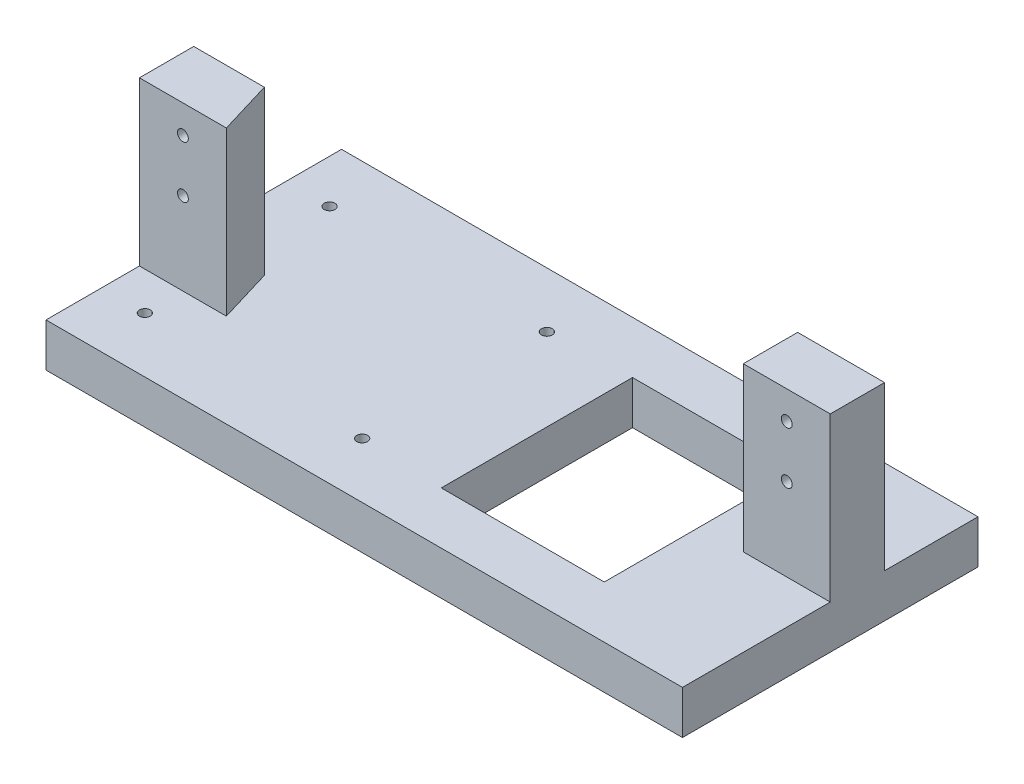
ISO-10303-21;
HEADER;
FILE_DESCRIPTION(('STEP AP214'),'2;1');
FILE_NAME('part.step','',(''),(''),'','','');
FILE_SCHEMA(('AUTOMOTIVE_DESIGN { 1 0 10303 214 1 1 1 1 }'));
ENDSEC;
DATA;
#1=APPLICATION_CONTEXT('core data for automotive mechanical design processes');
#2=APPLICATION_PROTOCOL_DEFINITION('international standard','automotive_design',2000,#1);
#3=PRODUCT_CONTEXT('',#1,'mechanical');
#4=PRODUCT('Part','Part','',(#3));
#5=PRODUCT_RELATED_PRODUCT_CATEGORY('part','',(#4));
#6=PRODUCT_DEFINITION_FORMATION('','',#4);
#7=PRODUCT_DEFINITION_CONTEXT('part definition',#1,'design');
#8=PRODUCT_DEFINITION('design','',#6,#7);
#9=PRODUCT_DEFINITION_SHAPE('','',#8);
#10=(LENGTH_UNIT() NAMED_UNIT(*) SI_UNIT(.MILLI.,.METRE.));
#11=(NAMED_UNIT(*) PLANE_ANGLE_UNIT() SI_UNIT($,.RADIAN.));
#12=(NAMED_UNIT(*) SI_UNIT($,.STERADIAN.) SOLID_ANGLE_UNIT());
#13=UNCERTAINTY_MEASURE_WITH_UNIT(LENGTH_MEASURE(1.E-05),#10,'distance_accuracy_value','');
#14=(GEOMETRIC_REPRESENTATION_CONTEXT(3) GLOBAL_UNCERTAINTY_ASSIGNED_CONTEXT((#13)) GLOBAL_UNIT_ASSIGNED_CONTEXT((#10,
#11,#12)) REPRESENTATION_CONTEXT('',''));
#15=CARTESIAN_POINT('',(0.,0.,0.));
#16=DIRECTION('',(0.,0.,1.));
#17=DIRECTION('',(1.,0.,0.));
#18=AXIS2_PLACEMENT_3D('',#15,#16,#17);
#19=CARTESIAN_POINT('',(0.,5.08,0.));
#20=DIRECTION('',(0.,-1.,0.));
#21=DIRECTION('',(0.,0.,-1.));
#22=AXIS2_PLACEMENT_3D('',#19,#20,#21);
#23=PLANE('',#22);
#24=CARTESIAN_POINT('',(5.08,5.08,-6.477));
#25=DIRECTION('',(0.,-1.,0.));
#26=DIRECTION('',(0.,0.,-1.));
#27=AXIS2_PLACEMENT_3D('',#24,#25,#26);
#28=CIRCLE('',#27,0.635000000000001);
#29=CARTESIAN_POINT('',(5.08,5.08,-7.112));
#30=VERTEX_POINT('',#29);
#31=EDGE_CURVE('E316',#30,#30,#28,.T.);
#32=ORIENTED_EDGE('',*,*,#31,.T.);
#33=EDGE_LOOP('',(#32));
#34=FACE_BOUND('',#33,.T.);
#35=CARTESIAN_POINT('',(30.48,5.08,-6.47699999999999));
#36=DIRECTION('',(0.,-1.,0.));
#37=DIRECTION('',(0.,0.,-1.));
#38=AXIS2_PLACEMENT_3D('',#35,#36,#37);
#39=CIRCLE('',#38,0.634999999999999);
#40=CARTESIAN_POINT('',(30.48,5.08,-7.11199999999999));
#41=VERTEX_POINT('',#40);
#42=EDGE_CURVE('E310',#41,#41,#39,.T.);
#43=ORIENTED_EDGE('',*,*,#42,.T.);
#44=EDGE_LOOP('',(#43));
#45=FACE_BOUND('',#44,.T.);
#46=CARTESIAN_POINT('',(30.48,5.08,-28.067));
#47=DIRECTION('',(0.,-1.,0.));
#48=DIRECTION('',(0.,0.,-1.));
#49=AXIS2_PLACEMENT_3D('',#46,#47,#48);
#50=CIRCLE('',#49,0.634999999999999);
#51=CARTESIAN_POINT('',(30.48,5.08,-28.702));
#52=VERTEX_POINT('',#51);
#53=EDGE_CURVE('E304',#52,#52,#50,.T.);
#54=ORIENTED_EDGE('',*,*,#53,.T.);
#55=EDGE_LOOP('',(#54));
#56=FACE_BOUND('',#55,.T.);
#57=CARTESIAN_POINT('',(5.08,5.08,-28.067));
#58=DIRECTION('',(0.,-1.,0.));
#59=DIRECTION('',(0.,0.,-1.));
#60=AXIS2_PLACEMENT_3D('',#57,#58,#59);
#61=CIRCLE('',#60,0.635);
#62=CARTESIAN_POINT('',(5.08,5.08,-28.702));
#63=VERTEX_POINT('',#62);
#64=EDGE_CURVE('E288',#63,#63,#61,.T.);
#65=ORIENTED_EDGE('',*,*,#64,.T.);
#66=EDGE_LOOP('',(#65));
#67=FACE_BOUND('',#66,.T.);
#68=DIRECTION('',(1.,0.,0.));
#69=VECTOR('',#68,1.);
#70=CARTESIAN_POINT('',(40.10914,5.08,-6.096));
#71=LINE('',#70,#69);
#72=CARTESIAN_POINT('',(40.10914,5.08,-6.096));
#73=VERTEX_POINT('',#72);
#74=CARTESIAN_POINT('',(59.15914,5.08,-6.096));
#75=VERTEX_POINT('',#74);
#76=EDGE_CURVE('E284',#73,#75,#71,.T.);
#77=ORIENTED_EDGE('',*,*,#76,.F.);
#78=DIRECTION('',(0.,0.,1.));
#79=VECTOR('',#78,1.);
#80=CARTESIAN_POINT('',(40.10914,5.08,-28.448));
#81=LINE('',#80,#79);
#82=CARTESIAN_POINT('',(40.10914,5.08,-28.448));
#83=VERTEX_POINT('',#82);
#84=EDGE_CURVE('E60',#83,#73,#81,.T.);
#85=ORIENTED_EDGE('',*,*,#84,.F.);
#86=DIRECTION('',(-1.,0.,0.));
#87=VECTOR('',#86,1.);
#88=CARTESIAN_POINT('',(40.10914,5.08,-28.448));
#89=LINE('',#88,#87);
#90=CARTESIAN_POINT('',(59.15914,5.08,-28.448));
#91=VERTEX_POINT('',#90);
#92=EDGE_CURVE('E277',#91,#83,#89,.T.);
#93=ORIENTED_EDGE('',*,*,#92,.F.);
#94=DIRECTION('',(0.,0.,-1.));
#95=VECTOR('',#94,1.);
#96=CARTESIAN_POINT('',(59.15914,5.08,-28.448));
#97=LINE('',#96,#95);
#98=EDGE_CURVE('E281',#75,#91,#97,.T.);
#99=ORIENTED_EDGE('',*,*,#98,.F.);
#100=EDGE_LOOP('',(#77,#85,#93,#99));
#101=FACE_BOUND('',#100,.T.);
#102=DIRECTION('',(-1.,0.,0.));
#103=VECTOR('',#102,1.);
#104=CARTESIAN_POINT('',(74.39914,5.08,-23.622));
#105=LINE('',#104,#103);
#106=CARTESIAN_POINT('',(74.39914,5.08,-23.622));
#107=VERTEX_POINT('',#106);
#108=CARTESIAN_POINT('',(64.23914,5.08,-23.622));
#109=VERTEX_POINT('',#108);
#110=EDGE_CURVE('E254',#107,#109,#105,.T.);
#111=ORIENTED_EDGE('',*,*,#110,.F.);
#112=DIRECTION('',(0.,0.,-1.));
#113=VECTOR('',#112,1.);
#114=CARTESIAN_POINT('',(74.39914,5.08,0.));
#115=LINE('',#114,#113);
#116=CARTESIAN_POINT('',(74.39914,5.08,-34.544));
#117=VERTEX_POINT('',#116);
#118=EDGE_CURVE('E222',#107,#117,#115,.T.);
#119=ORIENTED_EDGE('',*,*,#118,.T.);
#120=DIRECTION('',(-1.,0.,0.));
#121=VECTOR('',#120,1.);
#122=CARTESIAN_POINT('',(0.,5.08,-34.544));
#123=LINE('',#122,#121);
#124=CARTESIAN_POINT('',(0.,5.08,-34.544));
#125=VERTEX_POINT('',#124);
#126=EDGE_CURVE('E210',#117,#125,#123,.T.);
#127=ORIENTED_EDGE('',*,*,#126,.T.);
#128=DIRECTION('',(0.,0.,1.));
#129=VECTOR('',#128,1.);
#130=CARTESIAN_POINT('',(0.,5.08,0.));
#131=LINE('',#130,#129);
#132=CARTESIAN_POINT('',(0.,5.08,-17.272));
#133=VERTEX_POINT('',#132);
#134=EDGE_CURVE('E167',#125,#133,#131,.T.);
#135=ORIENTED_EDGE('',*,*,#134,.T.);
#136=DIRECTION('',(-1.,0.,0.));
#137=VECTOR('',#136,1.);
#138=CARTESIAN_POINT('',(0.,5.08,-17.272));
#139=LINE('',#138,#137);
#140=CARTESIAN_POINT('',(8.255,5.08,-17.272));
#141=VERTEX_POINT('',#140);
#142=EDGE_CURVE('E38',#141,#133,#139,.T.);
#143=ORIENTED_EDGE('',*,*,#142,.F.);
#144=DIRECTION('',(0.287347885566345,0.,0.957826285221151));
#145=VECTOR('',#144,1.);
#146=CARTESIAN_POINT('',(10.16,5.08,-10.922));
#147=LINE('',#146,#145);
#148=CARTESIAN_POINT('',(10.16,5.08,-10.922));
#149=VERTEX_POINT('',#148);
#150=EDGE_CURVE('E148',#141,#149,#147,.T.);
#151=ORIENTED_EDGE('',*,*,#150,.T.);
#152=DIRECTION('',(1.,0.,0.));
#153=VECTOR('',#152,1.);
#154=CARTESIAN_POINT('',(0.,5.08,-10.922));
#155=LINE('',#154,#153);
#156=CARTESIAN_POINT('',(0.,5.08,-10.922));
#157=VERTEX_POINT('',#156);
#158=EDGE_CURVE('E169',#157,#149,#155,.T.);
#159=ORIENTED_EDGE('',*,*,#158,.F.);
#160=CARTESIAN_POINT('',(0.,5.08,0.));
#161=VERTEX_POINT('',#160);
#162=EDGE_CURVE('E198',#157,#161,#131,.T.);
#163=ORIENTED_EDGE('',*,*,#162,.T.);
#164=DIRECTION('',(1.,0.,0.));
#165=VECTOR('',#164,1.);
#166=CARTESIAN_POINT('',(0.,5.08,0.));
#167=LINE('',#166,#165);
#168=CARTESIAN_POINT('',(74.39914,5.08,0.));
#169=VERTEX_POINT('',#168);
#170=EDGE_CURVE('E194',#161,#169,#167,.T.);
#171=ORIENTED_EDGE('',*,*,#170,.T.);
#172=CARTESIAN_POINT('',(74.39914,5.08,-17.272));
#173=VERTEX_POINT('',#172);
#174=EDGE_CURVE('E221',#169,#173,#115,.T.);
#175=ORIENTED_EDGE('',*,*,#174,.T.);
#176=DIRECTION('',(1.,0.,0.));
#177=VECTOR('',#176,1.);
#178=CARTESIAN_POINT('',(74.39914,5.08,-17.272));
#179=LINE('',#178,#177);
#180=CARTESIAN_POINT('',(64.23914,5.08,-17.272));
#181=VERTEX_POINT('',#180);
#182=EDGE_CURVE('E249',#181,#173,#179,.T.);
#183=ORIENTED_EDGE('',*,*,#182,.F.);
#184=DIRECTION('',(0.,0.,1.));
#185=VECTOR('',#184,1.);
#186=CARTESIAN_POINT('',(64.23914,5.08,-23.622));
#187=LINE('',#186,#185);
#188=EDGE_CURVE('E251',#109,#181,#187,.T.);
#189=ORIENTED_EDGE('',*,*,#188,.F.);
#190=EDGE_LOOP('',(#111,#119,#127,#135,#143,#151,#159,#163,#171,#175,#183,#189));
#191=FACE_BOUND('',#190,.T.);
#192=ADVANCED_FACE('F34',(#34,#45,#56,#67,#101,#191),#23,.F.);
#193=CARTESIAN_POINT('',(0.,5.08,0.));
#194=DIRECTION('',(1.,0.,0.));
#195=DIRECTION('',(0.,0.,-1.));
#196=AXIS2_PLACEMENT_3D('',#193,#194,#195);
#197=PLANE('',#196);
#198=DIRECTION('',(0.,0.,1.));
#199=VECTOR('',#198,1.);
#200=CARTESIAN_POINT('',(0.,0.,0.));
#201=LINE('',#200,#199);
#202=CARTESIAN_POINT('',(0.,0.,-34.544));
#203=VERTEX_POINT('',#202);
#204=CARTESIAN_POINT('',(0.,0.,0.));
#205=VERTEX_POINT('',#204);
#206=EDGE_CURVE('E217',#203,#205,#201,.T.);
#207=ORIENTED_EDGE('',*,*,#206,.T.);
#208=DIRECTION('',(0.,-1.,0.));
#209=VECTOR('',#208,1.);
#210=CARTESIAN_POINT('',(0.,5.08,0.));
#211=LINE('',#210,#209);
#212=EDGE_CURVE('E11',#161,#205,#211,.T.);
#213=ORIENTED_EDGE('',*,*,#212,.F.);
#214=ORIENTED_EDGE('',*,*,#162,.F.);
#215=DIRECTION('',(0.,-1.,0.));
#216=VECTOR('',#215,1.);
#217=CARTESIAN_POINT('',(0.,24.13,-10.922));
#218=LINE('',#217,#216);
#219=CARTESIAN_POINT('',(0.,24.13,-10.922));
#220=VERTEX_POINT('',#219);
#221=EDGE_CURVE('E191',#220,#157,#218,.T.);
#222=ORIENTED_EDGE('',*,*,#221,.F.);
#223=DIRECTION('',(0.,0.,1.));
#224=VECTOR('',#223,1.);
#225=CARTESIAN_POINT('',(0.,24.13,-17.272));
#226=LINE('',#225,#224);
#227=CARTESIAN_POINT('',(0.,24.13,-17.272));
#228=VERTEX_POINT('',#227);
#229=EDGE_CURVE('E184',#228,#220,#226,.T.);
#230=ORIENTED_EDGE('',*,*,#229,.F.);
#231=DIRECTION('',(0.,-1.,0.));
#232=VECTOR('',#231,1.);
#233=CARTESIAN_POINT('',(0.,24.13,-17.272));
#234=LINE('',#233,#232);
#235=EDGE_CURVE('E220',#228,#133,#234,.T.);
#236=ORIENTED_EDGE('',*,*,#235,.T.);
#237=ORIENTED_EDGE('',*,*,#134,.F.);
#238=DIRECTION('',(0.,-1.,0.));
#239=VECTOR('',#238,1.);
#240=CARTESIAN_POINT('',(0.,5.08,-34.544));
#241=LINE('',#240,#239);
#242=EDGE_CURVE('E207',#125,#203,#241,.T.);
#243=ORIENTED_EDGE('',*,*,#242,.T.);
#244=EDGE_LOOP('',(#207,#213,#214,#222,#230,#236,#237,#243));
#245=FACE_BOUND('',#244,.T.);
#246=ADVANCED_FACE('F36',(#245),#197,.F.);
#247=CARTESIAN_POINT('',(0.,5.08,0.));
#248=DIRECTION('',(0.,0.,-1.));
#249=DIRECTION('',(-1.,0.,0.));
#250=AXIS2_PLACEMENT_3D('',#247,#248,#249);
#251=PLANE('',#250);
#252=DIRECTION('',(1.,0.,0.));
#253=VECTOR('',#252,1.);
#254=CARTESIAN_POINT('',(0.,0.,0.));
#255=LINE('',#254,#253);
#256=CARTESIAN_POINT('',(74.39914,0.,0.));
#257=VERTEX_POINT('',#256);
#258=EDGE_CURVE('E215',#205,#257,#255,.T.);
#259=ORIENTED_EDGE('',*,*,#258,.T.);
#260=DIRECTION('',(0.,-1.,0.));
#261=VECTOR('',#260,1.);
#262=CARTESIAN_POINT('',(74.39914,5.08,0.));
#263=LINE('',#262,#261);
#264=EDGE_CURVE('E44',#169,#257,#263,.T.);
#265=ORIENTED_EDGE('',*,*,#264,.F.);
#266=ORIENTED_EDGE('',*,*,#170,.F.);
#267=ORIENTED_EDGE('',*,*,#212,.T.);
#268=EDGE_LOOP('',(#259,#265,#266,#267));
#269=FACE_BOUND('',#268,.T.);
#270=ADVANCED_FACE('F231',(#269),#251,.F.);
#271=CARTESIAN_POINT('',(74.39914,5.08,0.));
#272=DIRECTION('',(-1.,0.,0.));
#273=DIRECTION('',(0.,0.,1.));
#274=AXIS2_PLACEMENT_3D('',#271,#272,#273);
#275=PLANE('',#274);
#276=DIRECTION('',(0.,0.,-1.));
#277=VECTOR('',#276,1.);
#278=CARTESIAN_POINT('',(74.39914,0.,0.));
#279=LINE('',#278,#277);
#280=CARTESIAN_POINT('',(74.39914,0.,-34.544));
#281=VERTEX_POINT('',#280);
#282=EDGE_CURVE('E213',#257,#281,#279,.T.);
#283=ORIENTED_EDGE('',*,*,#282,.T.);
#284=DIRECTION('',(0.,-1.,0.));
#285=VECTOR('',#284,1.);
#286=CARTESIAN_POINT('',(74.39914,5.08,-34.544));
#287=LINE('',#286,#285);
#288=EDGE_CURVE('E204',#117,#281,#287,.T.);
#289=ORIENTED_EDGE('',*,*,#288,.F.);
#290=ORIENTED_EDGE('',*,*,#118,.F.);
#291=DIRECTION('',(0.,-1.,0.));
#292=VECTOR('',#291,1.);
#293=CARTESIAN_POINT('',(74.39914,24.13,-23.622));
#294=LINE('',#293,#292);
#295=CARTESIAN_POINT('',(74.39914,24.13,-23.622));
#296=VERTEX_POINT('',#295);
#297=EDGE_CURVE('E170',#296,#107,#294,.T.);
#298=ORIENTED_EDGE('',*,*,#297,.F.);
#299=DIRECTION('',(0.,0.,-1.));
#300=VECTOR('',#299,1.);
#301=CARTESIAN_POINT('',(74.39914,24.13,-23.622));
#302=LINE('',#301,#300);
#303=CARTESIAN_POINT('',(74.39914,24.13,-17.272));
#304=VERTEX_POINT('',#303);
#305=EDGE_CURVE('E240',#304,#296,#302,.T.);
#306=ORIENTED_EDGE('',*,*,#305,.F.);
#307=DIRECTION('',(0.,-1.,0.));
#308=VECTOR('',#307,1.);
#309=CARTESIAN_POINT('',(74.39914,24.13,-17.272));
#310=LINE('',#309,#308);
#311=EDGE_CURVE('E238',#304,#173,#310,.T.);
#312=ORIENTED_EDGE('',*,*,#311,.T.);
#313=ORIENTED_EDGE('',*,*,#174,.F.);
#314=ORIENTED_EDGE('',*,*,#264,.T.);
#315=EDGE_LOOP('',(#283,#289,#290,#298,#306,#312,#313,#314));
#316=FACE_BOUND('',#315,.T.);
#317=ADVANCED_FACE('F235',(#316),#275,.F.);
#318=CARTESIAN_POINT('',(0.,5.08,-34.544));
#319=DIRECTION('',(0.,0.,1.));
#320=DIRECTION('',(1.,0.,0.));
#321=AXIS2_PLACEMENT_3D('',#318,#319,#320);
#322=PLANE('',#321);
#323=DIRECTION('',(-1.,0.,0.));
#324=VECTOR('',#323,1.);
#325=CARTESIAN_POINT('',(0.,0.,-34.544));
#326=LINE('',#325,#324);
#327=EDGE_CURVE('E211',#281,#203,#326,.T.);
#328=ORIENTED_EDGE('',*,*,#327,.T.);
#329=ORIENTED_EDGE('',*,*,#242,.F.);
#330=ORIENTED_EDGE('',*,*,#126,.F.);
#331=ORIENTED_EDGE('',*,*,#288,.T.);
#332=EDGE_LOOP('',(#328,#329,#330,#331));
#333=FACE_BOUND('',#332,.T.);
#334=ADVANCED_FACE('F345',(#333),#322,.F.);
#335=CARTESIAN_POINT('',(0.,0.,0.));
#336=DIRECTION('',(0.,-1.,0.));
#337=DIRECTION('',(0.,0.,-1.));
#338=AXIS2_PLACEMENT_3D('',#335,#336,#337);
#339=PLANE('',#338);
#340=CARTESIAN_POINT('',(5.08,0.,-6.477));
#341=DIRECTION('',(0.,-1.,0.));
#342=DIRECTION('',(0.,0.,-1.));
#343=AXIS2_PLACEMENT_3D('',#340,#341,#342);
#344=CIRCLE('',#343,0.635000000000001);
#345=CARTESIAN_POINT('',(5.08,0.,-7.112));
#346=VERTEX_POINT('',#345);
#347=EDGE_CURVE('E319',#346,#346,#344,.T.);
#348=ORIENTED_EDGE('',*,*,#347,.F.);
#349=EDGE_LOOP('',(#348));
#350=FACE_BOUND('',#349,.T.);
#351=CARTESIAN_POINT('',(30.48,0.,-6.47699999999999));
#352=DIRECTION('',(0.,-1.,0.));
#353=DIRECTION('',(0.,0.,-1.));
#354=AXIS2_PLACEMENT_3D('',#351,#352,#353);
#355=CIRCLE('',#354,0.634999999999999);
#356=CARTESIAN_POINT('',(30.48,0.,-7.11199999999999));
#357=VERTEX_POINT('',#356);
#358=EDGE_CURVE('E313',#357,#357,#355,.T.);
#359=ORIENTED_EDGE('',*,*,#358,.F.);
#360=EDGE_LOOP('',(#359));
#361=FACE_BOUND('',#360,.T.);
#362=CARTESIAN_POINT('',(30.48,0.,-28.067));
#363=DIRECTION('',(0.,-1.,0.));
#364=DIRECTION('',(0.,0.,-1.));
#365=AXIS2_PLACEMENT_3D('',#362,#363,#364);
#366=CIRCLE('',#365,0.634999999999999);
#367=CARTESIAN_POINT('',(30.48,0.,-28.702));
#368=VERTEX_POINT('',#367);
#369=EDGE_CURVE('E307',#368,#368,#366,.T.);
#370=ORIENTED_EDGE('',*,*,#369,.F.);
#371=EDGE_LOOP('',(#370));
#372=FACE_BOUND('',#371,.T.);
#373=CARTESIAN_POINT('',(5.08,0.,-28.067));
#374=DIRECTION('',(0.,-1.,0.));
#375=DIRECTION('',(0.,0.,-1.));
#376=AXIS2_PLACEMENT_3D('',#373,#374,#375);
#377=CIRCLE('',#376,0.635);
#378=CARTESIAN_POINT('',(5.08,0.,-28.702));
#379=VERTEX_POINT('',#378);
#380=EDGE_CURVE('E301',#379,#379,#377,.T.);
#381=ORIENTED_EDGE('',*,*,#380,.F.);
#382=EDGE_LOOP('',(#381));
#383=FACE_BOUND('',#382,.T.);
#384=DIRECTION('',(0.,0.,1.));
#385=VECTOR('',#384,1.);
#386=CARTESIAN_POINT('',(40.10914,0.,-28.448));
#387=LINE('',#386,#385);
#388=CARTESIAN_POINT('',(40.10914,0.,-28.448));
#389=VERTEX_POINT('',#388);
#390=CARTESIAN_POINT('',(40.10914,0.,-6.096));
#391=VERTEX_POINT('',#390);
#392=EDGE_CURVE('E280',#389,#391,#387,.T.);
#393=ORIENTED_EDGE('',*,*,#392,.T.);
#394=DIRECTION('',(1.,0.,0.));
#395=VECTOR('',#394,1.);
#396=CARTESIAN_POINT('',(40.10914,0.,-6.096));
#397=LINE('',#396,#395);
#398=CARTESIAN_POINT('',(59.15914,0.,-6.096));
#399=VERTEX_POINT('',#398);
#400=EDGE_CURVE('E294',#391,#399,#397,.T.);
#401=ORIENTED_EDGE('',*,*,#400,.T.);
#402=DIRECTION('',(0.,0.,-1.));
#403=VECTOR('',#402,1.);
#404=CARTESIAN_POINT('',(59.15914,0.,-28.448));
#405=LINE('',#404,#403);
#406=CARTESIAN_POINT('',(59.15914,0.,-28.448));
#407=VERTEX_POINT('',#406);
#408=EDGE_CURVE('E291',#399,#407,#405,.T.);
#409=ORIENTED_EDGE('',*,*,#408,.T.);
#410=DIRECTION('',(-1.,0.,0.));
#411=VECTOR('',#410,1.);
#412=CARTESIAN_POINT('',(40.10914,0.,-28.448));
#413=LINE('',#412,#411);
#414=EDGE_CURVE('E272',#407,#389,#413,.T.);
#415=ORIENTED_EDGE('',*,*,#414,.T.);
#416=EDGE_LOOP('',(#393,#401,#409,#415));
#417=FACE_BOUND('',#416,.T.);
#418=ORIENTED_EDGE('',*,*,#206,.F.);
#419=ORIENTED_EDGE('',*,*,#327,.F.);
#420=ORIENTED_EDGE('',*,*,#282,.F.);
#421=ORIENTED_EDGE('',*,*,#258,.F.);
#422=EDGE_LOOP('',(#418,#419,#420,#421));
#423=FACE_BOUND('',#422,.T.);
#424=ADVANCED_FACE('F342',(#350,#361,#372,#383,#417,#423),#339,.T.);
#425=CARTESIAN_POINT('',(0.,24.13,-17.272));
#426=DIRECTION('',(0.,0.,1.));
#427=DIRECTION('',(1.,0.,0.));
#428=AXIS2_PLACEMENT_3D('',#425,#426,#427);
#429=PLANE('',#428);
#430=CARTESIAN_POINT('',(5.08,14.732,-17.272));
#431=DIRECTION('',(0.,0.,-1.));
#432=DIRECTION('',(-1.,0.,0.));
#433=AXIS2_PLACEMENT_3D('',#430,#431,#432);
#434=CIRCLE('',#433,0.635000000000002);
#435=CARTESIAN_POINT('',(4.445,14.732,-17.272));
#436=VERTEX_POINT('',#435);
#437=EDGE_CURVE('E155',#436,#436,#434,.T.);
#438=ORIENTED_EDGE('',*,*,#437,.F.);
#439=EDGE_LOOP('',(#438));
#440=FACE_BOUND('',#439,.T.);
#441=CARTESIAN_POINT('',(5.08,20.828,-17.272));
#442=DIRECTION('',(0.,0.,-1.));
#443=DIRECTION('',(-1.,0.,0.));
#444=AXIS2_PLACEMENT_3D('',#441,#442,#443);
#445=CIRCLE('',#444,0.635000000000002);
#446=CARTESIAN_POINT('',(4.445,20.828,-17.272));
#447=VERTEX_POINT('',#446);
#448=EDGE_CURVE('E323',#447,#447,#445,.T.);
#449=ORIENTED_EDGE('',*,*,#448,.F.);
#450=EDGE_LOOP('',(#449));
#451=FACE_BOUND('',#450,.T.);
#452=DIRECTION('',(-1.,0.,0.));
#453=VECTOR('',#452,1.);
#454=CARTESIAN_POINT('',(0.,24.13,-17.272));
#455=LINE('',#454,#453);
#456=CARTESIAN_POINT('',(8.255,24.13,-17.272));
#457=VERTEX_POINT('',#456);
#458=EDGE_CURVE('E162',#457,#228,#455,.T.);
#459=ORIENTED_EDGE('',*,*,#458,.F.);
#460=DIRECTION('',(0.,1.,0.));
#461=VECTOR('',#460,1.);
#462=CARTESIAN_POINT('',(8.255,-1.5495946331582,-17.272));
#463=LINE('',#462,#461);
#464=EDGE_CURVE('E52',#141,#457,#463,.T.);
#465=ORIENTED_EDGE('',*,*,#464,.F.);
#466=ORIENTED_EDGE('',*,*,#142,.T.);
#467=ORIENTED_EDGE('',*,*,#235,.F.);
#468=EDGE_LOOP('',(#459,#465,#466,#467));
#469=FACE_BOUND('',#468,.T.);
#470=ADVANCED_FACE('F159',(#440,#451,#469),#429,.F.);
#471=CARTESIAN_POINT('',(0.,24.13,-10.922));
#472=DIRECTION('',(0.,0.,-1.));
#473=DIRECTION('',(-1.,0.,0.));
#474=AXIS2_PLACEMENT_3D('',#471,#472,#473);
#475=PLANE('',#474);
#476=CARTESIAN_POINT('',(5.08,14.732,-10.922));
#477=DIRECTION('',(0.,0.,-1.));
#478=DIRECTION('',(-1.,0.,0.));
#479=AXIS2_PLACEMENT_3D('',#476,#477,#478);
#480=CIRCLE('',#479,0.635000000000002);
#481=CARTESIAN_POINT('',(4.445,14.732,-10.922));
#482=VERTEX_POINT('',#481);
#483=EDGE_CURVE('E326',#482,#482,#480,.T.);
#484=ORIENTED_EDGE('',*,*,#483,.T.);
#485=EDGE_LOOP('',(#484));
#486=FACE_BOUND('',#485,.T.);
#487=CARTESIAN_POINT('',(5.08,20.828,-10.922));
#488=DIRECTION('',(0.,0.,-1.));
#489=DIRECTION('',(-1.,0.,0.));
#490=AXIS2_PLACEMENT_3D('',#487,#488,#489);
#491=CIRCLE('',#490,0.635000000000002);
#492=CARTESIAN_POINT('',(4.445,20.828,-10.922));
#493=VERTEX_POINT('',#492);
#494=EDGE_CURVE('E322',#493,#493,#491,.T.);
#495=ORIENTED_EDGE('',*,*,#494,.T.);
#496=EDGE_LOOP('',(#495));
#497=FACE_BOUND('',#496,.T.);
#498=ORIENTED_EDGE('',*,*,#158,.T.);
#499=DIRECTION('',(0.,-1.,0.));
#500=VECTOR('',#499,1.);
#501=CARTESIAN_POINT('',(10.16,24.13,-10.922));
#502=LINE('',#501,#500);
#503=CARTESIAN_POINT('',(10.16,24.13,-10.922));
#504=VERTEX_POINT('',#503);
#505=EDGE_CURVE('E151',#504,#149,#502,.T.);
#506=ORIENTED_EDGE('',*,*,#505,.F.);
#507=DIRECTION('',(1.,0.,0.));
#508=VECTOR('',#507,1.);
#509=CARTESIAN_POINT('',(0.,24.13,-10.922));
#510=LINE('',#509,#508);
#511=EDGE_CURVE('E186',#220,#504,#510,.T.);
#512=ORIENTED_EDGE('',*,*,#511,.F.);
#513=ORIENTED_EDGE('',*,*,#221,.T.);
#514=EDGE_LOOP('',(#498,#506,#512,#513));
#515=FACE_BOUND('',#514,.T.);
#516=ADVANCED_FACE('F336',(#486,#497,#515),#475,.F.);
#517=CARTESIAN_POINT('',(0.,24.13,0.));
#518=DIRECTION('',(0.,1.,0.));
#519=DIRECTION('',(0.,0.,1.));
#520=AXIS2_PLACEMENT_3D('',#517,#518,#519);
#521=PLANE('',#520);
#522=DIRECTION('',(0.287347885566345,0.,0.957826285221151));
#523=VECTOR('',#522,1.);
#524=CARTESIAN_POINT('',(10.16,24.13,-10.922));
#525=LINE('',#524,#523);
#526=EDGE_CURVE('E163',#457,#504,#525,.T.);
#527=ORIENTED_EDGE('',*,*,#526,.F.);
#528=ORIENTED_EDGE('',*,*,#458,.T.);
#529=ORIENTED_EDGE('',*,*,#229,.T.);
#530=ORIENTED_EDGE('',*,*,#511,.T.);
#531=EDGE_LOOP('',(#527,#528,#529,#530));
#532=FACE_BOUND('',#531,.T.);
#533=ADVANCED_FACE('F331',(#532),#521,.T.);
#534=CARTESIAN_POINT('',(74.39914,24.13,-23.622));
#535=DIRECTION('',(0.,0.,1.));
#536=DIRECTION('',(1.,0.,0.));
#537=AXIS2_PLACEMENT_3D('',#534,#535,#536);
#538=PLANE('',#537);
#539=CARTESIAN_POINT('',(69.31914,14.732,-23.622));
#540=DIRECTION('',(0.,0.,-1.));
#541=DIRECTION('',(-1.,0.,0.));
#542=AXIS2_PLACEMENT_3D('',#539,#540,#541);
#543=CIRCLE('',#542,0.635000000000002);
#544=CARTESIAN_POINT('',(68.68414,14.732,-23.622));
#545=VERTEX_POINT('',#544);
#546=EDGE_CURVE('E265',#545,#545,#543,.T.);
#547=ORIENTED_EDGE('',*,*,#546,.F.);
#548=EDGE_LOOP('',(#547));
#549=FACE_BOUND('',#548,.T.);
#550=CARTESIAN_POINT('',(69.31914,20.828,-23.622));
#551=DIRECTION('',(0.,0.,-1.));
#552=DIRECTION('',(-1.,0.,0.));
#553=AXIS2_PLACEMENT_3D('',#550,#551,#552);
#554=CIRCLE('',#553,0.635000000000002);
#555=CARTESIAN_POINT('',(68.68414,20.828,-23.622));
#556=VERTEX_POINT('',#555);
#557=EDGE_CURVE('E261',#556,#556,#554,.T.);
#558=ORIENTED_EDGE('',*,*,#557,.F.);
#559=EDGE_LOOP('',(#558));
#560=FACE_BOUND('',#559,.T.);
#561=ORIENTED_EDGE('',*,*,#110,.T.);
#562=DIRECTION('',(0.,-1.,0.));
#563=VECTOR('',#562,1.);
#564=CARTESIAN_POINT('',(64.23914,24.13,-23.622));
#565=LINE('',#564,#563);
#566=CARTESIAN_POINT('',(64.23914,24.13,-23.622));
#567=VERTEX_POINT('',#566);
#568=EDGE_CURVE('E173',#567,#109,#565,.T.);
#569=ORIENTED_EDGE('',*,*,#568,.F.);
#570=DIRECTION('',(-1.,0.,0.));
#571=VECTOR('',#570,1.);
#572=CARTESIAN_POINT('',(74.39914,24.13,-23.622));
#573=LINE('',#572,#571);
#574=EDGE_CURVE('E258',#296,#567,#573,.T.);
#575=ORIENTED_EDGE('',*,*,#574,.F.);
#576=ORIENTED_EDGE('',*,*,#297,.T.);
#577=EDGE_LOOP('',(#561,#569,#575,#576));
#578=FACE_BOUND('',#577,.T.);
#579=ADVANCED_FACE('F430',(#549,#560,#578),#538,.F.);
#580=CARTESIAN_POINT('',(64.23914,24.13,-23.622));
#581=DIRECTION('',(1.,0.,0.));
#582=DIRECTION('',(0.,0.,-1.));
#583=AXIS2_PLACEMENT_3D('',#580,#581,#582);
#584=PLANE('',#583);
#585=ORIENTED_EDGE('',*,*,#188,.T.);
#586=DIRECTION('',(0.,-1.,0.));
#587=VECTOR('',#586,1.);
#588=CARTESIAN_POINT('',(64.23914,24.13,-17.272));
#589=LINE('',#588,#587);
#590=CARTESIAN_POINT('',(64.23914,24.13,-17.272));
#591=VERTEX_POINT('',#590);
#592=EDGE_CURVE('E179',#591,#181,#589,.T.);
#593=ORIENTED_EDGE('',*,*,#592,.F.);
#594=DIRECTION('',(0.,0.,1.));
#595=VECTOR('',#594,1.);
#596=CARTESIAN_POINT('',(64.23914,24.13,-23.622));
#597=LINE('',#596,#595);
#598=EDGE_CURVE('E246',#567,#591,#597,.T.);
#599=ORIENTED_EDGE('',*,*,#598,.F.);
#600=ORIENTED_EDGE('',*,*,#568,.T.);
#601=EDGE_LOOP('',(#585,#593,#599,#600));
#602=FACE_BOUND('',#601,.T.);
#603=ADVANCED_FACE('F438',(#602),#584,.F.);
#604=CARTESIAN_POINT('',(74.39914,24.13,-17.272));
#605=DIRECTION('',(0.,0.,-1.));
#606=DIRECTION('',(-1.,0.,0.));
#607=AXIS2_PLACEMENT_3D('',#604,#605,#606);
#608=PLANE('',#607);
#609=CARTESIAN_POINT('',(69.31914,14.732,-17.272));
#610=DIRECTION('',(0.,0.,-1.));
#611=DIRECTION('',(-1.,0.,0.));
#612=AXIS2_PLACEMENT_3D('',#609,#610,#611);
#613=CIRCLE('',#612,0.635000000000002);
#614=CARTESIAN_POINT('',(68.68414,14.732,-17.272));
#615=VERTEX_POINT('',#614);
#616=EDGE_CURVE('E264',#615,#615,#613,.T.);
#617=ORIENTED_EDGE('',*,*,#616,.T.);
#618=EDGE_LOOP('',(#617));
#619=FACE_BOUND('',#618,.T.);
#620=CARTESIAN_POINT('',(69.31914,20.828,-17.272));
#621=DIRECTION('',(0.,0.,-1.));
#622=DIRECTION('',(-1.,0.,0.));
#623=AXIS2_PLACEMENT_3D('',#620,#621,#622);
#624=CIRCLE('',#623,0.635000000000002);
#625=CARTESIAN_POINT('',(68.68414,20.828,-17.272));
#626=VERTEX_POINT('',#625);
#627=EDGE_CURVE('E255',#626,#626,#624,.T.);
#628=ORIENTED_EDGE('',*,*,#627,.T.);
#629=EDGE_LOOP('',(#628));
#630=FACE_BOUND('',#629,.T.);
#631=ORIENTED_EDGE('',*,*,#182,.T.);
#632=ORIENTED_EDGE('',*,*,#311,.F.);
#633=DIRECTION('',(1.,0.,0.));
#634=VECTOR('',#633,1.);
#635=CARTESIAN_POINT('',(74.39914,24.13,-17.272));
#636=LINE('',#635,#634);
#637=EDGE_CURVE('E243',#591,#304,#636,.T.);
#638=ORIENTED_EDGE('',*,*,#637,.F.);
#639=ORIENTED_EDGE('',*,*,#592,.T.);
#640=EDGE_LOOP('',(#631,#632,#638,#639));
#641=FACE_BOUND('',#640,.T.);
#642=ADVANCED_FACE('F447',(#619,#630,#641),#608,.F.);
#643=CARTESIAN_POINT('',(0.,24.13,0.));
#644=DIRECTION('',(0.,-1.,0.));
#645=DIRECTION('',(0.,0.,-1.));
#646=AXIS2_PLACEMENT_3D('',#643,#644,#645);
#647=PLANE('',#646);
#648=ORIENTED_EDGE('',*,*,#305,.T.);
#649=ORIENTED_EDGE('',*,*,#574,.T.);
#650=ORIENTED_EDGE('',*,*,#598,.T.);
#651=ORIENTED_EDGE('',*,*,#637,.T.);
#652=EDGE_LOOP('',(#648,#649,#650,#651));
#653=FACE_BOUND('',#652,.T.);
#654=ADVANCED_FACE('F454',(#653),#647,.F.);
#655=CARTESIAN_POINT('',(69.31914,20.828,2.50000000041883E-05));
#656=DIRECTION('',(0.,0.,-1.));
#657=DIRECTION('',(-1.,0.,0.));
#658=AXIS2_PLACEMENT_3D('',#655,#656,#657);
#659=CYLINDRICAL_SURFACE('',#658,0.635000000000002);
#660=ORIENTED_EDGE('',*,*,#557,.T.);
#661=EDGE_LOOP('',(#660));
#662=FACE_BOUND('',#661,.T.);
#663=ORIENTED_EDGE('',*,*,#627,.F.);
#664=EDGE_LOOP('',(#663));
#665=FACE_BOUND('',#664,.T.);
#666=ADVANCED_FACE('F462',(#662,#665),#659,.F.);
#667=CARTESIAN_POINT('',(69.31914,14.732,2.50000000041883E-05));
#668=DIRECTION('',(0.,0.,-1.));
#669=DIRECTION('',(-1.,0.,0.));
#670=AXIS2_PLACEMENT_3D('',#667,#668,#669);
#671=CYLINDRICAL_SURFACE('',#670,0.635000000000002);
#672=ORIENTED_EDGE('',*,*,#546,.T.);
#673=EDGE_LOOP('',(#672));
#674=FACE_BOUND('',#673,.T.);
#675=ORIENTED_EDGE('',*,*,#616,.F.);
#676=EDGE_LOOP('',(#675));
#677=FACE_BOUND('',#676,.T.);
#678=ADVANCED_FACE('F469',(#674,#677),#671,.F.);
#679=CARTESIAN_POINT('',(40.10914,0.,-28.448));
#680=DIRECTION('',(-1.,0.,0.));
#681=DIRECTION('',(0.,0.,1.));
#682=AXIS2_PLACEMENT_3D('',#679,#680,#681);
#683=PLANE('',#682);
#684=ORIENTED_EDGE('',*,*,#84,.T.);
#685=DIRECTION('',(0.,1.,0.));
#686=VECTOR('',#685,1.);
#687=CARTESIAN_POINT('',(40.10914,0.,-6.096));
#688=LINE('',#687,#686);
#689=EDGE_CURVE('E269',#391,#73,#688,.T.);
#690=ORIENTED_EDGE('',*,*,#689,.F.);
#691=ORIENTED_EDGE('',*,*,#392,.F.);
#692=DIRECTION('',(0.,1.,0.));
#693=VECTOR('',#692,1.);
#694=CARTESIAN_POINT('',(40.10914,0.,-28.448));
#695=LINE('',#694,#693);
#696=EDGE_CURVE('E268',#389,#83,#695,.T.);
#697=ORIENTED_EDGE('',*,*,#696,.T.);
#698=EDGE_LOOP('',(#684,#690,#691,#697));
#699=FACE_BOUND('',#698,.T.);
#700=ADVANCED_FACE('F477',(#699),#683,.F.);
#701=CARTESIAN_POINT('',(40.10914,0.,-28.448));
#702=DIRECTION('',(0.,0.,-1.));
#703=DIRECTION('',(-1.,0.,0.));
#704=AXIS2_PLACEMENT_3D('',#701,#702,#703);
#705=PLANE('',#704);
#706=ORIENTED_EDGE('',*,*,#92,.T.);
#707=ORIENTED_EDGE('',*,*,#696,.F.);
#708=ORIENTED_EDGE('',*,*,#414,.F.);
#709=DIRECTION('',(0.,1.,0.));
#710=VECTOR('',#709,1.);
#711=CARTESIAN_POINT('',(59.15914,0.,-28.448));
#712=LINE('',#711,#710);
#713=EDGE_CURVE('E274',#407,#91,#712,.T.);
#714=ORIENTED_EDGE('',*,*,#713,.T.);
#715=EDGE_LOOP('',(#706,#707,#708,#714));
#716=FACE_BOUND('',#715,.T.);
#717=ADVANCED_FACE('F485',(#716),#705,.F.);
#718=CARTESIAN_POINT('',(59.15914,0.,-28.448));
#719=DIRECTION('',(1.,0.,0.));
#720=DIRECTION('',(0.,0.,-1.));
#721=AXIS2_PLACEMENT_3D('',#718,#719,#720);
#722=PLANE('',#721);
#723=ORIENTED_EDGE('',*,*,#98,.T.);
#724=ORIENTED_EDGE('',*,*,#713,.F.);
#725=ORIENTED_EDGE('',*,*,#408,.F.);
#726=DIRECTION('',(0.,1.,0.));
#727=VECTOR('',#726,1.);
#728=CARTESIAN_POINT('',(59.15914,0.,-6.096));
#729=LINE('',#728,#727);
#730=EDGE_CURVE('E271',#399,#75,#729,.T.);
#731=ORIENTED_EDGE('',*,*,#730,.T.);
#732=EDGE_LOOP('',(#723,#724,#725,#731));
#733=FACE_BOUND('',#732,.T.);
#734=ADVANCED_FACE('F492',(#733),#722,.F.);
#735=CARTESIAN_POINT('',(40.10914,0.,-6.096));
#736=DIRECTION('',(0.,0.,1.));
#737=DIRECTION('',(1.,0.,0.));
#738=AXIS2_PLACEMENT_3D('',#735,#736,#737);
#739=PLANE('',#738);
#740=ORIENTED_EDGE('',*,*,#76,.T.);
#741=ORIENTED_EDGE('',*,*,#730,.F.);
#742=ORIENTED_EDGE('',*,*,#400,.F.);
#743=ORIENTED_EDGE('',*,*,#689,.T.);
#744=EDGE_LOOP('',(#740,#741,#742,#743));
#745=FACE_BOUND('',#744,.T.);
#746=ADVANCED_FACE('F500',(#745),#739,.F.);
#747=CARTESIAN_POINT('',(5.08,24.130025,-28.067));
#748=DIRECTION('',(0.,-1.,0.));
#749=DIRECTION('',(0.,0.,-1.));
#750=AXIS2_PLACEMENT_3D('',#747,#748,#749);
#751=CYLINDRICAL_SURFACE('',#750,0.635);
#752=ORIENTED_EDGE('',*,*,#380,.T.);
#753=EDGE_LOOP('',(#752));
#754=FACE_BOUND('',#753,.T.);
#755=ORIENTED_EDGE('',*,*,#64,.F.);
#756=EDGE_LOOP('',(#755));
#757=FACE_BOUND('',#756,.T.);
#758=ADVANCED_FACE('F507',(#754,#757),#751,.F.);
#759=CARTESIAN_POINT('',(30.48,24.130025,-28.067));
#760=DIRECTION('',(0.,-1.,0.));
#761=DIRECTION('',(0.,0.,-1.));
#762=AXIS2_PLACEMENT_3D('',#759,#760,#761);
#763=CYLINDRICAL_SURFACE('',#762,0.634999999999999);
#764=ORIENTED_EDGE('',*,*,#369,.T.);
#765=EDGE_LOOP('',(#764));
#766=FACE_BOUND('',#765,.T.);
#767=ORIENTED_EDGE('',*,*,#53,.F.);
#768=EDGE_LOOP('',(#767));
#769=FACE_BOUND('',#768,.T.);
#770=ADVANCED_FACE('F514',(#766,#769),#763,.F.);
#771=CARTESIAN_POINT('',(30.48,24.130025,-6.47699999999999));
#772=DIRECTION('',(0.,-1.,0.));
#773=DIRECTION('',(0.,0.,-1.));
#774=AXIS2_PLACEMENT_3D('',#771,#772,#773);
#775=CYLINDRICAL_SURFACE('',#774,0.634999999999999);
#776=ORIENTED_EDGE('',*,*,#358,.T.);
#777=EDGE_LOOP('',(#776));
#778=FACE_BOUND('',#777,.T.);
#779=ORIENTED_EDGE('',*,*,#42,.F.);
#780=EDGE_LOOP('',(#779));
#781=FACE_BOUND('',#780,.T.);
#782=ADVANCED_FACE('F522',(#778,#781),#775,.F.);
#783=CARTESIAN_POINT('',(5.08,24.130025,-6.477));
#784=DIRECTION('',(0.,-1.,0.));
#785=DIRECTION('',(0.,0.,-1.));
#786=AXIS2_PLACEMENT_3D('',#783,#784,#785);
#787=CYLINDRICAL_SURFACE('',#786,0.635000000000001);
#788=ORIENTED_EDGE('',*,*,#347,.T.);
#789=EDGE_LOOP('',(#788));
#790=FACE_BOUND('',#789,.T.);
#791=ORIENTED_EDGE('',*,*,#31,.F.);
#792=EDGE_LOOP('',(#791));
#793=FACE_BOUND('',#792,.T.);
#794=ADVANCED_FACE('F374',(#790,#793),#787,.F.);
#795=CARTESIAN_POINT('',(5.08,20.828,2.50000000007189E-05));
#796=DIRECTION('',(0.,0.,-1.));
#797=DIRECTION('',(-1.,0.,0.));
#798=AXIS2_PLACEMENT_3D('',#795,#796,#797);
#799=CYLINDRICAL_SURFACE('',#798,0.635000000000002);
#800=ORIENTED_EDGE('',*,*,#448,.T.);
#801=EDGE_LOOP('',(#800));
#802=FACE_BOUND('',#801,.T.);
#803=ORIENTED_EDGE('',*,*,#494,.F.);
#804=EDGE_LOOP('',(#803));
#805=FACE_BOUND('',#804,.T.);
#806=ADVANCED_FACE('F366',(#802,#805),#799,.F.);
#807=CARTESIAN_POINT('',(5.08,14.732,2.50000000007189E-05));
#808=DIRECTION('',(0.,0.,-1.));
#809=DIRECTION('',(-1.,0.,0.));
#810=AXIS2_PLACEMENT_3D('',#807,#808,#809);
#811=CYLINDRICAL_SURFACE('',#810,0.635000000000002);
#812=ORIENTED_EDGE('',*,*,#437,.T.);
#813=EDGE_LOOP('',(#812));
#814=FACE_BOUND('',#813,.T.);
#815=ORIENTED_EDGE('',*,*,#483,.F.);
#816=EDGE_LOOP('',(#815));
#817=FACE_BOUND('',#816,.T.);
#818=ADVANCED_FACE('F364',(#814,#817),#811,.F.);
#819=CARTESIAN_POINT('',(10.16,-1.5495946331582,-10.922));
#820=DIRECTION('',(-0.957826285221151,0.,0.287347885566345));
#821=DIRECTION('',(0.287347885566345,0.,0.957826285221151));
#822=AXIS2_PLACEMENT_3D('',#819,#820,#821);
#823=PLANE('',#822);
#824=ORIENTED_EDGE('',*,*,#464,.T.);
#825=ORIENTED_EDGE('',*,*,#526,.T.);
#826=ORIENTED_EDGE('',*,*,#505,.T.);
#827=ORIENTED_EDGE('',*,*,#150,.F.);
#828=EDGE_LOOP('',(#824,#825,#826,#827));
#829=FACE_BOUND('',#828,.T.);
#830=ADVANCED_FACE('F149',(#829),#823,.F.);
#831=CLOSED_SHELL('',(#192,#246,#270,#317,#334,#424,#470,#516,#533,#579,#603,#642,#654,#666,
#678,#700,#717,#734,#746,#758,#770,#782,#794,#806,#818,#830));
#832=MANIFOLD_SOLID_BREP('B2',#831);
#833=ADVANCED_BREP_SHAPE_REPRESENTATION('',(#18,#832),#14);
#834=SHAPE_DEFINITION_REPRESENTATION(#9,#833);
ENDSEC;
END-ISO-10303-21;
